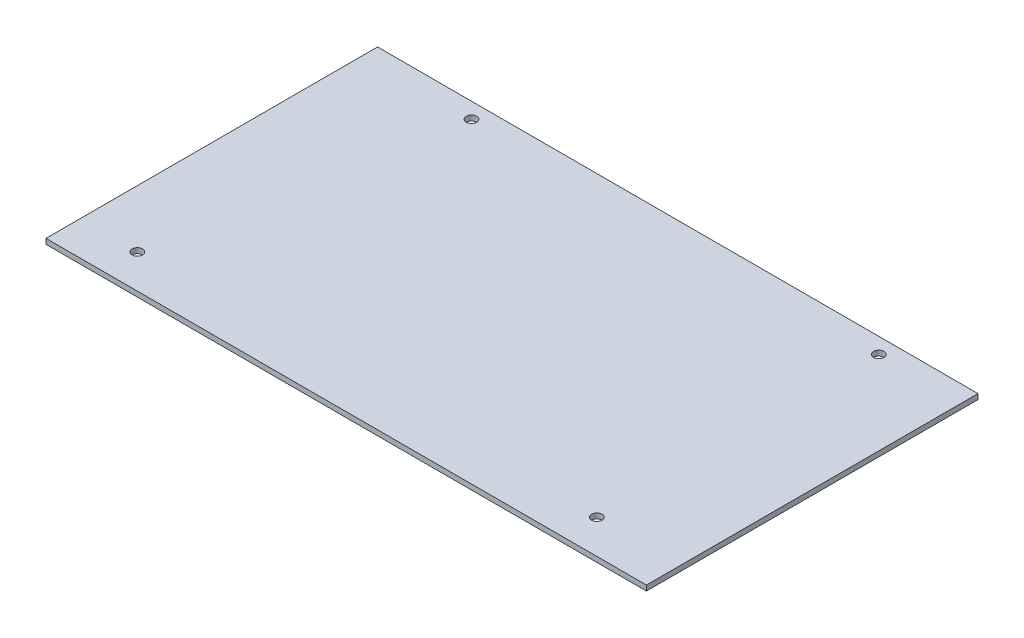
ISO-10303-21;
HEADER;
FILE_DESCRIPTION(('STEP AP214'),'2;1');
FILE_NAME('part.step','',(''),(''),'','','');
FILE_SCHEMA(('AUTOMOTIVE_DESIGN { 1 0 10303 214 1 1 1 1 }'));
ENDSEC;
DATA;
#1=APPLICATION_CONTEXT('core data for automotive mechanical design processes');
#2=APPLICATION_PROTOCOL_DEFINITION('international standard','automotive_design',2000,#1);
#3=PRODUCT_CONTEXT('',#1,'mechanical');
#4=PRODUCT('Part','Part','',(#3));
#5=PRODUCT_RELATED_PRODUCT_CATEGORY('part','',(#4));
#6=PRODUCT_DEFINITION_FORMATION('','',#4);
#7=PRODUCT_DEFINITION_CONTEXT('part definition',#1,'design');
#8=PRODUCT_DEFINITION('design','',#6,#7);
#9=PRODUCT_DEFINITION_SHAPE('','',#8);
#10=(LENGTH_UNIT() NAMED_UNIT(*) SI_UNIT(.MILLI.,.METRE.));
#11=(NAMED_UNIT(*) PLANE_ANGLE_UNIT() SI_UNIT($,.RADIAN.));
#12=(NAMED_UNIT(*) SI_UNIT($,.STERADIAN.) SOLID_ANGLE_UNIT());
#13=UNCERTAINTY_MEASURE_WITH_UNIT(LENGTH_MEASURE(1.E-05),#10,'distance_accuracy_value','');
#14=(GEOMETRIC_REPRESENTATION_CONTEXT(3) GLOBAL_UNCERTAINTY_ASSIGNED_CONTEXT((#13)) GLOBAL_UNIT_ASSIGNED_CONTEXT((#10,
#11,#12)) REPRESENTATION_CONTEXT('',''));
#15=CARTESIAN_POINT('',(0.,0.,0.));
#16=DIRECTION('',(0.,0.,1.));
#17=DIRECTION('',(1.,0.,0.));
#18=AXIS2_PLACEMENT_3D('',#15,#16,#17);
#19=CARTESIAN_POINT('',(0.,1.,0.));
#20=DIRECTION('',(0.,1.,0.));
#21=DIRECTION('',(0.,0.,1.));
#22=AXIS2_PLACEMENT_3D('',#19,#20,#21);
#23=PLANE('',#22);
#24=CARTESIAN_POINT('',(41.5,1.,-28.75));
#25=DIRECTION('',(0.,1.,0.));
#26=DIRECTION('',(0.,0.,1.));
#27=AXIS2_PLACEMENT_3D('',#24,#25,#26);
#28=CIRCLE('',#27,0.999999999999998);
#29=CARTESIAN_POINT('',(41.5,1.,-27.75));
#30=VERTEX_POINT('',#29);
#31=EDGE_CURVE('E144',#30,#30,#28,.T.);
#32=ORIENTED_EDGE('',*,*,#31,.F.);
#33=EDGE_LOOP('',(#32));
#34=FACE_BOUND('',#33,.T.);
#35=CARTESIAN_POINT('',(-46.5,1.,25.25));
#36=DIRECTION('',(0.,1.,0.));
#37=DIRECTION('',(0.,0.,1.));
#38=AXIS2_PLACEMENT_3D('',#35,#36,#37);
#39=CIRCLE('',#38,0.999999999999998);
#40=CARTESIAN_POINT('',(-46.5,1.,26.25));
#41=VERTEX_POINT('',#40);
#42=EDGE_CURVE('E114',#41,#41,#39,.T.);
#43=ORIENTED_EDGE('',*,*,#42,.F.);
#44=EDGE_LOOP('',(#43));
#45=FACE_BOUND('',#44,.T.);
#46=DIRECTION('',(0.,0.,-1.));
#47=VECTOR('',#46,1.);
#48=CARTESIAN_POINT('',(57.5,1.,-31.75));
#49=LINE('',#48,#47);
#50=CARTESIAN_POINT('',(57.5,1.,31.75));
#51=VERTEX_POINT('',#50);
#52=CARTESIAN_POINT('',(57.5,1.,-31.75));
#53=VERTEX_POINT('',#52);
#54=EDGE_CURVE('E94',#51,#53,#49,.T.);
#55=ORIENTED_EDGE('',*,*,#54,.T.);
#56=DIRECTION('',(-1.,0.,0.));
#57=VECTOR('',#56,1.);
#58=CARTESIAN_POINT('',(-57.5,1.,-31.75));
#59=LINE('',#58,#57);
#60=CARTESIAN_POINT('',(-57.5,1.,-31.75));
#61=VERTEX_POINT('',#60);
#62=EDGE_CURVE('E89',#53,#61,#59,.T.);
#63=ORIENTED_EDGE('',*,*,#62,.T.);
#64=DIRECTION('',(0.,0.,1.));
#65=VECTOR('',#64,1.);
#66=CARTESIAN_POINT('',(-57.5,1.,-31.75));
#67=LINE('',#66,#65);
#68=CARTESIAN_POINT('',(-57.5,1.,31.75));
#69=VERTEX_POINT('',#68);
#70=EDGE_CURVE('E92',#61,#69,#67,.T.);
#71=ORIENTED_EDGE('',*,*,#70,.T.);
#72=DIRECTION('',(1.,0.,0.));
#73=VECTOR('',#72,1.);
#74=CARTESIAN_POINT('',(-57.5,1.,31.75));
#75=LINE('',#74,#73);
#76=EDGE_CURVE('E59',#69,#51,#75,.T.);
#77=ORIENTED_EDGE('',*,*,#76,.T.);
#78=EDGE_LOOP('',(#55,#63,#71,#77));
#79=FACE_BOUND('',#78,.T.);
#80=CARTESIAN_POINT('',(-36.5,1.,-28.75));
#81=DIRECTION('',(0.,1.,0.));
#82=DIRECTION('',(0.,0.,1.));
#83=AXIS2_PLACEMENT_3D('',#80,#81,#82);
#84=CIRCLE('',#83,0.999999999999998);
#85=CARTESIAN_POINT('',(-36.5,1.,-27.75));
#86=VERTEX_POINT('',#85);
#87=EDGE_CURVE('E136',#86,#86,#84,.T.);
#88=ORIENTED_EDGE('',*,*,#87,.F.);
#89=EDGE_LOOP('',(#88));
#90=FACE_BOUND('',#89,.T.);
#91=CARTESIAN_POINT('',(41.5,1.,25.25));
#92=DIRECTION('',(0.,1.,0.));
#93=DIRECTION('',(0.,0.,1.));
#94=AXIS2_PLACEMENT_3D('',#91,#92,#93);
#95=CIRCLE('',#94,0.999999999999998);
#96=CARTESIAN_POINT('',(41.5,1.,26.25));
#97=VERTEX_POINT('',#96);
#98=EDGE_CURVE('E152',#97,#97,#95,.T.);
#99=ORIENTED_EDGE('',*,*,#98,.F.);
#100=EDGE_LOOP('',(#99));
#101=FACE_BOUND('',#100,.T.);
#102=ADVANCED_FACE('F41',(#34,#45,#79,#90,#101),#23,.T.);
#103=CARTESIAN_POINT('',(0.,0.,0.));
#104=DIRECTION('',(0.,1.,0.));
#105=DIRECTION('',(0.,0.,1.));
#106=AXIS2_PLACEMENT_3D('',#103,#104,#105);
#107=PLANE('',#106);
#108=DIRECTION('',(0.,0.,-1.));
#109=VECTOR('',#108,1.);
#110=CARTESIAN_POINT('',(57.5,0.,-31.75));
#111=LINE('',#110,#109);
#112=CARTESIAN_POINT('',(57.5,0.,31.75));
#113=VERTEX_POINT('',#112);
#114=CARTESIAN_POINT('',(57.5,0.,-31.75));
#115=VERTEX_POINT('',#114);
#116=EDGE_CURVE('E110',#113,#115,#111,.T.);
#117=ORIENTED_EDGE('',*,*,#116,.F.);
#118=DIRECTION('',(1.,0.,0.));
#119=VECTOR('',#118,1.);
#120=CARTESIAN_POINT('',(-57.5,0.,31.75));
#121=LINE('',#120,#119);
#122=CARTESIAN_POINT('',(-57.5,0.,31.75));
#123=VERTEX_POINT('',#122);
#124=EDGE_CURVE('E82',#123,#113,#121,.T.);
#125=ORIENTED_EDGE('',*,*,#124,.F.);
#126=DIRECTION('',(0.,0.,1.));
#127=VECTOR('',#126,1.);
#128=CARTESIAN_POINT('',(-57.5,0.,-31.75));
#129=LINE('',#128,#127);
#130=CARTESIAN_POINT('',(-57.5,0.,-31.75));
#131=VERTEX_POINT('',#130);
#132=EDGE_CURVE('E76',#131,#123,#129,.T.);
#133=ORIENTED_EDGE('',*,*,#132,.F.);
#134=DIRECTION('',(-1.,0.,0.));
#135=VECTOR('',#134,1.);
#136=CARTESIAN_POINT('',(-57.5,0.,-31.75));
#137=LINE('',#136,#135);
#138=EDGE_CURVE('E99',#115,#131,#137,.T.);
#139=ORIENTED_EDGE('',*,*,#138,.F.);
#140=EDGE_LOOP('',(#117,#125,#133,#139));
#141=FACE_BOUND('',#140,.T.);
#142=CARTESIAN_POINT('',(-46.5,0.,25.25));
#143=DIRECTION('',(0.,1.,0.));
#144=DIRECTION('',(0.,0.,1.));
#145=AXIS2_PLACEMENT_3D('',#142,#143,#144);
#146=CIRCLE('',#145,0.999999999999998);
#147=CARTESIAN_POINT('',(-46.5,0.,26.25));
#148=VERTEX_POINT('',#147);
#149=EDGE_CURVE('E132',#148,#148,#146,.T.);
#150=ORIENTED_EDGE('',*,*,#149,.T.);
#151=EDGE_LOOP('',(#150));
#152=FACE_BOUND('',#151,.T.);
#153=CARTESIAN_POINT('',(-36.5,0.,-28.75));
#154=DIRECTION('',(0.,1.,0.));
#155=DIRECTION('',(0.,0.,1.));
#156=AXIS2_PLACEMENT_3D('',#153,#154,#155);
#157=CIRCLE('',#156,0.999999999999998);
#158=CARTESIAN_POINT('',(-36.5,0.,-27.75));
#159=VERTEX_POINT('',#158);
#160=EDGE_CURVE('E140',#159,#159,#157,.T.);
#161=ORIENTED_EDGE('',*,*,#160,.T.);
#162=EDGE_LOOP('',(#161));
#163=FACE_BOUND('',#162,.T.);
#164=CARTESIAN_POINT('',(41.5,0.,-28.75));
#165=DIRECTION('',(0.,1.,0.));
#166=DIRECTION('',(0.,0.,1.));
#167=AXIS2_PLACEMENT_3D('',#164,#165,#166);
#168=CIRCLE('',#167,0.999999999999998);
#169=CARTESIAN_POINT('',(41.5,0.,-27.75));
#170=VERTEX_POINT('',#169);
#171=EDGE_CURVE('E148',#170,#170,#168,.T.);
#172=ORIENTED_EDGE('',*,*,#171,.T.);
#173=EDGE_LOOP('',(#172));
#174=FACE_BOUND('',#173,.T.);
#175=CARTESIAN_POINT('',(41.5,0.,25.25));
#176=DIRECTION('',(0.,1.,0.));
#177=DIRECTION('',(0.,0.,1.));
#178=AXIS2_PLACEMENT_3D('',#175,#176,#177);
#179=CIRCLE('',#178,0.999999999999998);
#180=CARTESIAN_POINT('',(41.5,0.,26.25));
#181=VERTEX_POINT('',#180);
#182=EDGE_CURVE('E156',#181,#181,#179,.T.);
#183=ORIENTED_EDGE('',*,*,#182,.T.);
#184=EDGE_LOOP('',(#183));
#185=FACE_BOUND('',#184,.T.);
#186=ADVANCED_FACE('F127',(#141,#152,#163,#174,#185),#107,.F.);
#187=CARTESIAN_POINT('',(57.5,1.,-31.75));
#188=DIRECTION('',(-1.,0.,0.));
#189=DIRECTION('',(0.,0.,1.));
#190=AXIS2_PLACEMENT_3D('',#187,#188,#189);
#191=PLANE('',#190);
#192=ORIENTED_EDGE('',*,*,#116,.T.);
#193=DIRECTION('',(0.,-1.,0.));
#194=VECTOR('',#193,1.);
#195=CARTESIAN_POINT('',(57.5,1.,-31.75));
#196=LINE('',#195,#194);
#197=EDGE_CURVE('E11',#53,#115,#196,.T.);
#198=ORIENTED_EDGE('',*,*,#197,.F.);
#199=ORIENTED_EDGE('',*,*,#54,.F.);
#200=DIRECTION('',(0.,-1.,0.));
#201=VECTOR('',#200,1.);
#202=CARTESIAN_POINT('',(57.5,1.,31.75));
#203=LINE('',#202,#201);
#204=EDGE_CURVE('E106',#51,#113,#203,.T.);
#205=ORIENTED_EDGE('',*,*,#204,.T.);
#206=EDGE_LOOP('',(#192,#198,#199,#205));
#207=FACE_BOUND('',#206,.T.);
#208=ADVANCED_FACE('F43',(#207),#191,.F.);
#209=CARTESIAN_POINT('',(-57.5,1.,-31.75));
#210=DIRECTION('',(0.,0.,1.));
#211=DIRECTION('',(1.,0.,0.));
#212=AXIS2_PLACEMENT_3D('',#209,#210,#211);
#213=PLANE('',#212);
#214=ORIENTED_EDGE('',*,*,#138,.T.);
#215=DIRECTION('',(0.,-1.,0.));
#216=VECTOR('',#215,1.);
#217=CARTESIAN_POINT('',(-57.5,1.,-31.75));
#218=LINE('',#217,#216);
#219=EDGE_CURVE('E51',#61,#131,#218,.T.);
#220=ORIENTED_EDGE('',*,*,#219,.F.);
#221=ORIENTED_EDGE('',*,*,#62,.F.);
#222=ORIENTED_EDGE('',*,*,#197,.T.);
#223=EDGE_LOOP('',(#214,#220,#221,#222));
#224=FACE_BOUND('',#223,.T.);
#225=ADVANCED_FACE('F98',(#224),#213,.F.);
#226=CARTESIAN_POINT('',(-57.5,1.,-31.75));
#227=DIRECTION('',(1.,0.,0.));
#228=DIRECTION('',(0.,0.,-1.));
#229=AXIS2_PLACEMENT_3D('',#226,#227,#228);
#230=PLANE('',#229);
#231=ORIENTED_EDGE('',*,*,#132,.T.);
#232=DIRECTION('',(0.,-1.,0.));
#233=VECTOR('',#232,1.);
#234=CARTESIAN_POINT('',(-57.5,1.,31.75));
#235=LINE('',#234,#233);
#236=EDGE_CURVE('E101',#69,#123,#235,.T.);
#237=ORIENTED_EDGE('',*,*,#236,.F.);
#238=ORIENTED_EDGE('',*,*,#70,.F.);
#239=ORIENTED_EDGE('',*,*,#219,.T.);
#240=EDGE_LOOP('',(#231,#237,#238,#239));
#241=FACE_BOUND('',#240,.T.);
#242=ADVANCED_FACE('F102',(#241),#230,.F.);
#243=CARTESIAN_POINT('',(-57.5,1.,31.75));
#244=DIRECTION('',(0.,0.,-1.));
#245=DIRECTION('',(-1.,0.,0.));
#246=AXIS2_PLACEMENT_3D('',#243,#244,#245);
#247=PLANE('',#246);
#248=ORIENTED_EDGE('',*,*,#124,.T.);
#249=ORIENTED_EDGE('',*,*,#204,.F.);
#250=ORIENTED_EDGE('',*,*,#76,.F.);
#251=ORIENTED_EDGE('',*,*,#236,.T.);
#252=EDGE_LOOP('',(#248,#249,#250,#251));
#253=FACE_BOUND('',#252,.T.);
#254=ADVANCED_FACE('F124',(#253),#247,.F.);
#255=CARTESIAN_POINT('',(-46.5,1.,25.25));
#256=DIRECTION('',(0.,-1.,0.));
#257=DIRECTION('',(0.,0.,-1.));
#258=AXIS2_PLACEMENT_3D('',#255,#256,#257);
#259=CYLINDRICAL_SURFACE('',#258,0.999999999999998);
#260=ORIENTED_EDGE('',*,*,#42,.T.);
#261=EDGE_LOOP('',(#260));
#262=FACE_BOUND('',#261,.T.);
#263=ORIENTED_EDGE('',*,*,#149,.F.);
#264=EDGE_LOOP('',(#263));
#265=FACE_BOUND('',#264,.T.);
#266=ADVANCED_FACE('F177',(#262,#265),#259,.F.);
#267=CARTESIAN_POINT('',(-36.5,1.,-28.75));
#268=DIRECTION('',(0.,-1.,0.));
#269=DIRECTION('',(0.,0.,-1.));
#270=AXIS2_PLACEMENT_3D('',#267,#268,#269);
#271=CYLINDRICAL_SURFACE('',#270,0.999999999999998);
#272=ORIENTED_EDGE('',*,*,#87,.T.);
#273=EDGE_LOOP('',(#272));
#274=FACE_BOUND('',#273,.T.);
#275=ORIENTED_EDGE('',*,*,#160,.F.);
#276=EDGE_LOOP('',(#275));
#277=FACE_BOUND('',#276,.T.);
#278=ADVANCED_FACE('F223',(#274,#277),#271,.F.);
#279=CARTESIAN_POINT('',(41.5,1.,-28.75));
#280=DIRECTION('',(0.,-1.,0.));
#281=DIRECTION('',(0.,0.,-1.));
#282=AXIS2_PLACEMENT_3D('',#279,#280,#281);
#283=CYLINDRICAL_SURFACE('',#282,0.999999999999998);
#284=ORIENTED_EDGE('',*,*,#31,.T.);
#285=EDGE_LOOP('',(#284));
#286=FACE_BOUND('',#285,.T.);
#287=ORIENTED_EDGE('',*,*,#171,.F.);
#288=EDGE_LOOP('',(#287));
#289=FACE_BOUND('',#288,.T.);
#290=ADVANCED_FACE('F231',(#286,#289),#283,.F.);
#291=CARTESIAN_POINT('',(41.5,1.,25.25));
#292=DIRECTION('',(0.,-1.,0.));
#293=DIRECTION('',(0.,0.,-1.));
#294=AXIS2_PLACEMENT_3D('',#291,#292,#293);
#295=CYLINDRICAL_SURFACE('',#294,0.999999999999998);
#296=ORIENTED_EDGE('',*,*,#98,.T.);
#297=EDGE_LOOP('',(#296));
#298=FACE_BOUND('',#297,.T.);
#299=ORIENTED_EDGE('',*,*,#182,.F.);
#300=EDGE_LOOP('',(#299));
#301=FACE_BOUND('',#300,.T.);
#302=ADVANCED_FACE('F164',(#298,#301),#295,.F.);
#303=CLOSED_SHELL('',(#102,#186,#208,#225,#242,#254,#266,#278,#290,#302));
#304=MANIFOLD_SOLID_BREP('B2',#303);
#305=ADVANCED_BREP_SHAPE_REPRESENTATION('',(#18,#304),#14);
#306=SHAPE_DEFINITION_REPRESENTATION(#9,#305);
ENDSEC;
END-ISO-10303-21;
